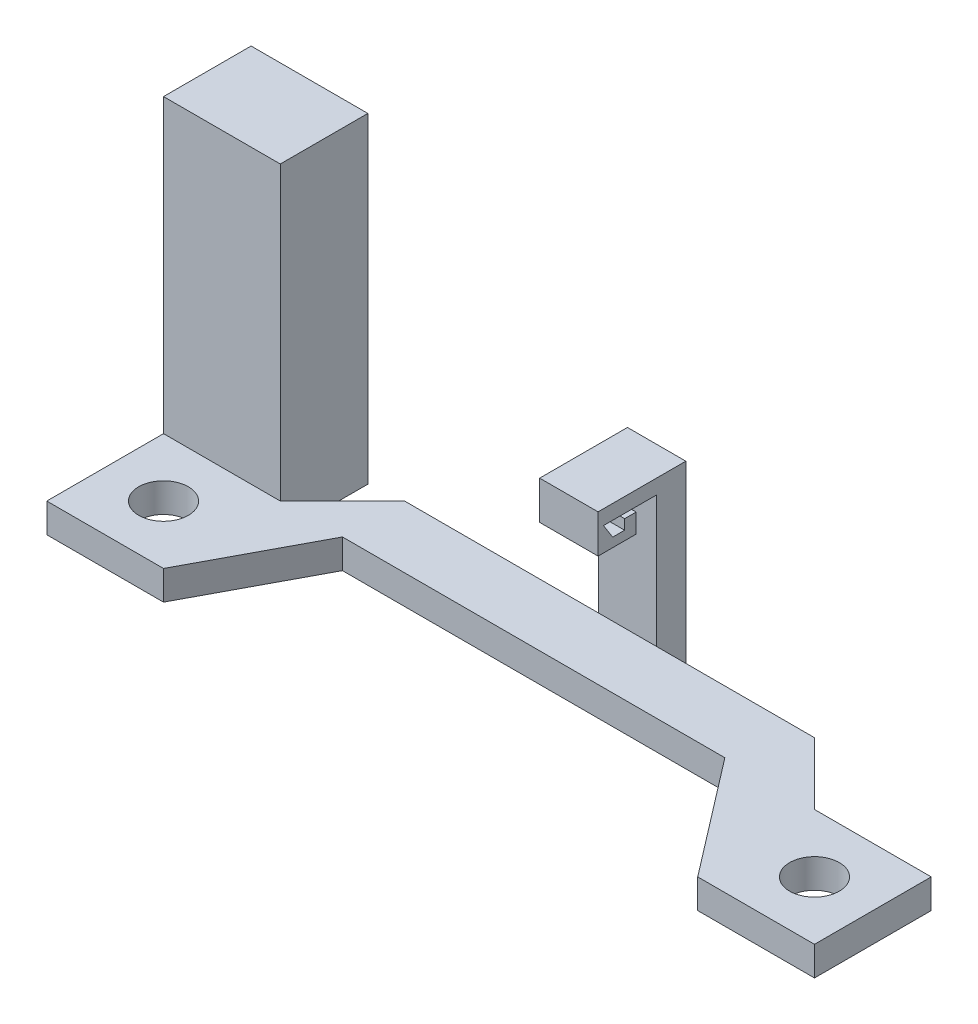
ISO-10303-21;
HEADER;
FILE_DESCRIPTION(('STEP AP214'),'2;1');
FILE_NAME('part.step','',(''),(''),'','','');
FILE_SCHEMA(('AUTOMOTIVE_DESIGN { 1 0 10303 214 1 1 1 1 }'));
ENDSEC;
DATA;
#1=APPLICATION_CONTEXT('core data for automotive mechanical design processes');
#2=APPLICATION_PROTOCOL_DEFINITION('international standard','automotive_design',2000,#1);
#3=PRODUCT_CONTEXT('',#1,'mechanical');
#4=PRODUCT('Part','Part','',(#3));
#5=PRODUCT_RELATED_PRODUCT_CATEGORY('part','',(#4));
#6=PRODUCT_DEFINITION_FORMATION('','',#4);
#7=PRODUCT_DEFINITION_CONTEXT('part definition',#1,'design');
#8=PRODUCT_DEFINITION('design','',#6,#7);
#9=PRODUCT_DEFINITION_SHAPE('','',#8);
#10=(LENGTH_UNIT() NAMED_UNIT(*) SI_UNIT(.MILLI.,.METRE.));
#11=(NAMED_UNIT(*) PLANE_ANGLE_UNIT() SI_UNIT($,.RADIAN.));
#12=(NAMED_UNIT(*) SI_UNIT($,.STERADIAN.) SOLID_ANGLE_UNIT());
#13=UNCERTAINTY_MEASURE_WITH_UNIT(LENGTH_MEASURE(1.E-05),#10,'distance_accuracy_value','');
#14=(GEOMETRIC_REPRESENTATION_CONTEXT(3) GLOBAL_UNCERTAINTY_ASSIGNED_CONTEXT((#13)) GLOBAL_UNIT_ASSIGNED_CONTEXT((#10,
#11,#12)) REPRESENTATION_CONTEXT('',''));
#15=CARTESIAN_POINT('',(0.,0.,0.));
#16=DIRECTION('',(0.,0.,1.));
#17=DIRECTION('',(1.,0.,0.));
#18=AXIS2_PLACEMENT_3D('',#15,#16,#17);
#19=CARTESIAN_POINT('',(46.1527781522757,2.54,-10.4892218477242));
#20=DIRECTION('',(0.,0.,1.));
#21=DIRECTION('',(1.,0.,0.));
#22=AXIS2_PLACEMENT_3D('',#19,#20,#21);
#23=PLANE('',#22);
#24=DIRECTION('',(-1.,0.,0.));
#25=VECTOR('',#24,1.);
#26=CARTESIAN_POINT('',(46.1527781522757,2.54,-10.4892218477242));
#27=LINE('',#26,#25);
#28=CARTESIAN_POINT('',(27.3386529054238,2.54,-10.4892218477242));
#29=VERTEX_POINT('',#28);
#30=CARTESIAN_POINT('',(10.4892218477242,2.54,-10.4892218477242));
#31=VERTEX_POINT('',#30);
#32=EDGE_CURVE('E57',#29,#31,#27,.T.);
#33=ORIENTED_EDGE('',*,*,#32,.F.);
#34=DIRECTION('',(0.,1.,0.));
#35=VECTOR('',#34,1.);
#36=CARTESIAN_POINT('',(27.3386529054238,0.,-10.4892218477242));
#37=LINE('',#36,#35);
#38=CARTESIAN_POINT('',(27.3386529054238,0.,-10.4892218477242));
#39=VERTEX_POINT('',#38);
#40=EDGE_CURVE('E354',#39,#29,#37,.T.);
#41=ORIENTED_EDGE('',*,*,#40,.F.);
#42=DIRECTION('',(-1.,0.,0.));
#43=VECTOR('',#42,1.);
#44=CARTESIAN_POINT('',(46.1527781522757,0.,-10.4892218477242));
#45=LINE('',#44,#43);
#46=CARTESIAN_POINT('',(10.4892218477242,0.,-10.4892218477242));
#47=VERTEX_POINT('',#46);
#48=EDGE_CURVE('E490',#39,#47,#45,.T.);
#49=ORIENTED_EDGE('',*,*,#48,.T.);
#50=DIRECTION('',(0.,-1.,0.));
#51=VECTOR('',#50,1.);
#52=CARTESIAN_POINT('',(10.4892218477242,2.54,-10.4892218477242));
#53=LINE('',#52,#51);
#54=EDGE_CURVE('E456',#31,#47,#53,.T.);
#55=ORIENTED_EDGE('',*,*,#54,.F.);
#56=EDGE_LOOP('',(#33,#41,#49,#55));
#57=FACE_BOUND('',#56,.T.);
#58=ADVANCED_FACE('F41',(#57),#23,.F.);
#59=CARTESIAN_POINT('',(0.,2.54,0.));
#60=DIRECTION('',(0.,1.,0.));
#61=DIRECTION('',(0.,0.,1.));
#62=AXIS2_PLACEMENT_3D('',#59,#60,#61);
#63=PLANE('',#62);
#64=CARTESIAN_POINT('',(0.,2.54,0.));
#65=DIRECTION('',(0.,1.,0.));
#66=DIRECTION('',(0.,0.,1.));
#67=AXIS2_PLACEMENT_3D('',#64,#65,#66);
#68=CIRCLE('',#67,2.159);
#69=CARTESIAN_POINT('',(0.,2.54,2.159));
#70=VERTEX_POINT('',#69);
#71=EDGE_CURVE('E409',#70,#70,#68,.T.);
#72=ORIENTED_EDGE('',*,*,#71,.F.);
#73=EDGE_LOOP('',(#72));
#74=FACE_BOUND('',#73,.T.);
#75=DIRECTION('',(-0.707106781186546,0.,0.707106781186549));
#76=VECTOR('',#75,1.);
#77=CARTESIAN_POINT('',(5.08000000000001,2.54,-5.08));
#78=LINE('',#77,#76);
#79=CARTESIAN_POINT('',(5.08000000000001,2.54,-5.08));
#80=VERTEX_POINT('',#79);
#81=EDGE_CURVE('E417',#31,#80,#78,.T.);
#82=ORIENTED_EDGE('',*,*,#81,.T.);
#83=DIRECTION('',(-1.,0.,0.));
#84=VECTOR('',#83,1.);
#85=CARTESIAN_POINT('',(5.08000000000001,2.54,-5.08));
#86=LINE('',#85,#84);
#87=CARTESIAN_POINT('',(-5.08,2.54,-5.08));
#88=VERTEX_POINT('',#87);
#89=EDGE_CURVE('E421',#80,#88,#86,.T.);
#90=ORIENTED_EDGE('',*,*,#89,.T.);
#91=DIRECTION('',(0.,0.,1.));
#92=VECTOR('',#91,1.);
#93=CARTESIAN_POINT('',(-5.08,2.54,-5.08));
#94=LINE('',#93,#92);
#95=CARTESIAN_POINT('',(-5.08,2.54,5.08));
#96=VERTEX_POINT('',#95);
#97=EDGE_CURVE('E426',#88,#96,#94,.T.);
#98=ORIENTED_EDGE('',*,*,#97,.T.);
#99=DIRECTION('',(1.,0.,0.));
#100=VECTOR('',#99,1.);
#101=CARTESIAN_POINT('',(-5.08,2.54,5.08));
#102=LINE('',#101,#100);
#103=CARTESIAN_POINT('',(5.08,2.54,5.08));
#104=VERTEX_POINT('',#103);
#105=EDGE_CURVE('E429',#96,#104,#102,.T.);
#106=ORIENTED_EDGE('',*,*,#105,.T.);
#107=DIRECTION('',(0.469949268426899,0.,-0.882693426453954));
#108=VECTOR('',#107,1.);
#109=CARTESIAN_POINT('',(5.08,2.54,5.08));
#110=LINE('',#109,#108);
#111=CARTESIAN_POINT('',(10.4892218477242,2.54,-5.08));
#112=VERTEX_POINT('',#111);
#113=EDGE_CURVE('E432',#104,#112,#110,.T.);
#114=ORIENTED_EDGE('',*,*,#113,.T.);
#115=DIRECTION('',(1.,0.,0.));
#116=VECTOR('',#115,1.);
#117=CARTESIAN_POINT('',(10.4892218477242,2.54,-5.08));
#118=LINE('',#117,#116);
#119=CARTESIAN_POINT('',(43.7641842977874,2.54,-5.08));
#120=VERTEX_POINT('',#119);
#121=EDGE_CURVE('E435',#112,#120,#118,.T.);
#122=ORIENTED_EDGE('',*,*,#121,.T.);
#123=DIRECTION('',(0.608848582260036,0.,0.793286457643104));
#124=VECTOR('',#123,1.);
#125=CARTESIAN_POINT('',(43.7641842977874,2.54,-5.08));
#126=LINE('',#125,#124);
#127=CARTESIAN_POINT('',(51.562,2.54,5.08));
#128=VERTEX_POINT('',#127);
#129=EDGE_CURVE('E438',#120,#128,#126,.T.);
#130=ORIENTED_EDGE('',*,*,#129,.T.);
#131=DIRECTION('',(1.,0.,0.));
#132=VECTOR('',#131,1.);
#133=CARTESIAN_POINT('',(61.722,2.54,5.08));
#134=LINE('',#133,#132);
#135=CARTESIAN_POINT('',(61.722,2.54,5.08));
#136=VERTEX_POINT('',#135);
#137=EDGE_CURVE('E441',#128,#136,#134,.T.);
#138=ORIENTED_EDGE('',*,*,#137,.T.);
#139=DIRECTION('',(0.,0.,-1.));
#140=VECTOR('',#139,1.);
#141=CARTESIAN_POINT('',(61.722,2.54,-5.08));
#142=LINE('',#141,#140);
#143=CARTESIAN_POINT('',(61.722,2.54,-5.08));
#144=VERTEX_POINT('',#143);
#145=EDGE_CURVE('E444',#136,#144,#142,.T.);
#146=ORIENTED_EDGE('',*,*,#145,.T.);
#147=DIRECTION('',(-1.,0.,0.));
#148=VECTOR('',#147,1.);
#149=CARTESIAN_POINT('',(56.642,2.54,-5.08));
#150=LINE('',#149,#148);
#151=CARTESIAN_POINT('',(51.562,2.54,-5.08));
#152=VERTEX_POINT('',#151);
#153=EDGE_CURVE('E447',#144,#152,#150,.T.);
#154=ORIENTED_EDGE('',*,*,#153,.T.);
#155=DIRECTION('',(-0.707106781186551,0.,-0.707106781186544));
#156=VECTOR('',#155,1.);
#157=CARTESIAN_POINT('',(51.562,2.54,-5.08));
#158=LINE('',#157,#156);
#159=CARTESIAN_POINT('',(46.1527781522757,2.54,-10.4892218477242));
#160=VERTEX_POINT('',#159);
#161=EDGE_CURVE('E450',#152,#160,#158,.T.);
#162=ORIENTED_EDGE('',*,*,#161,.T.);
#163=CARTESIAN_POINT('',(32.4186529054238,2.54,-10.4892218477242));
#164=VERTEX_POINT('',#163);
#165=EDGE_CURVE('E453',#160,#164,#27,.T.);
#166=ORIENTED_EDGE('',*,*,#165,.T.);
#167=EDGE_CURVE('E457',#164,#29,#27,.T.);
#168=ORIENTED_EDGE('',*,*,#167,.T.);
#169=ORIENTED_EDGE('',*,*,#32,.T.);
#170=EDGE_LOOP('',(#82,#90,#98,#106,#114,#122,#130,#138,#146,#154,#162,#166,#168,#169));
#171=FACE_BOUND('',#170,.T.);
#172=CARTESIAN_POINT('',(56.642,2.54,0.));
#173=DIRECTION('',(0.,1.,0.));
#174=DIRECTION('',(0.,0.,1.));
#175=AXIS2_PLACEMENT_3D('',#172,#173,#174);
#176=CIRCLE('',#175,2.15899999999999);
#177=CARTESIAN_POINT('',(56.642,2.54,2.15899999999999));
#178=VERTEX_POINT('',#177);
#179=EDGE_CURVE('E401',#178,#178,#176,.T.);
#180=ORIENTED_EDGE('',*,*,#179,.F.);
#181=EDGE_LOOP('',(#180));
#182=FACE_BOUND('',#181,.T.);
#183=ADVANCED_FACE('F558',(#74,#171,#182),#63,.T.);
#184=CARTESIAN_POINT('',(0.,0.,0.));
#185=DIRECTION('',(0.,1.,0.));
#186=DIRECTION('',(0.,0.,1.));
#187=AXIS2_PLACEMENT_3D('',#184,#185,#186);
#188=PLANE('',#187);
#189=DIRECTION('',(-0.707106781186546,0.,0.707106781186549));
#190=VECTOR('',#189,1.);
#191=CARTESIAN_POINT('',(5.08000000000001,0.,-5.08));
#192=LINE('',#191,#190);
#193=CARTESIAN_POINT('',(5.08000000000001,0.,-5.08));
#194=VERTEX_POINT('',#193);
#195=EDGE_CURVE('E413',#47,#194,#192,.T.);
#196=ORIENTED_EDGE('',*,*,#195,.F.);
#197=ORIENTED_EDGE('',*,*,#48,.F.);
#198=DIRECTION('',(0.,0.,1.));
#199=VECTOR('',#198,1.);
#200=CARTESIAN_POINT('',(27.3386529054238,0.,-13.0292218477242));
#201=LINE('',#200,#199);
#202=CARTESIAN_POINT('',(27.3386529054238,0.,-13.0292218477242));
#203=VERTEX_POINT('',#202);
#204=EDGE_CURVE('E349',#203,#39,#201,.T.);
#205=ORIENTED_EDGE('',*,*,#204,.F.);
#206=DIRECTION('',(-1.,0.,0.));
#207=VECTOR('',#206,1.);
#208=CARTESIAN_POINT('',(32.4186529054238,0.,-13.0292218477242));
#209=LINE('',#208,#207);
#210=CARTESIAN_POINT('',(32.4186529054238,0.,-13.0292218477242));
#211=VERTEX_POINT('',#210);
#212=EDGE_CURVE('E345',#211,#203,#209,.T.);
#213=ORIENTED_EDGE('',*,*,#212,.F.);
#214=DIRECTION('',(0.,0.,-1.));
#215=VECTOR('',#214,1.);
#216=CARTESIAN_POINT('',(32.4186529054238,0.,-10.4892218477242));
#217=LINE('',#216,#215);
#218=CARTESIAN_POINT('',(32.4186529054238,0.,-10.4892218477242));
#219=VERTEX_POINT('',#218);
#220=EDGE_CURVE('E237',#219,#211,#217,.T.);
#221=ORIENTED_EDGE('',*,*,#220,.F.);
#222=CARTESIAN_POINT('',(46.1527781522757,0.,-10.4892218477242));
#223=VERTEX_POINT('',#222);
#224=EDGE_CURVE('E422',#223,#219,#45,.T.);
#225=ORIENTED_EDGE('',*,*,#224,.F.);
#226=DIRECTION('',(-0.707106781186551,0.,-0.707106781186544));
#227=VECTOR('',#226,1.);
#228=CARTESIAN_POINT('',(51.562,0.,-5.08));
#229=LINE('',#228,#227);
#230=CARTESIAN_POINT('',(51.562,0.,-5.08));
#231=VERTEX_POINT('',#230);
#232=EDGE_CURVE('E487',#231,#223,#229,.T.);
#233=ORIENTED_EDGE('',*,*,#232,.F.);
#234=DIRECTION('',(-1.,0.,0.));
#235=VECTOR('',#234,1.);
#236=CARTESIAN_POINT('',(51.562,0.,-5.08));
#237=LINE('',#236,#235);
#238=CARTESIAN_POINT('',(61.722,0.,-5.08));
#239=VERTEX_POINT('',#238);
#240=EDGE_CURVE('E484',#239,#231,#237,.T.);
#241=ORIENTED_EDGE('',*,*,#240,.F.);
#242=DIRECTION('',(0.,0.,-1.));
#243=VECTOR('',#242,1.);
#244=CARTESIAN_POINT('',(61.722,0.,-5.08));
#245=LINE('',#244,#243);
#246=CARTESIAN_POINT('',(61.722,0.,5.08));
#247=VERTEX_POINT('',#246);
#248=EDGE_CURVE('E480',#247,#239,#245,.T.);
#249=ORIENTED_EDGE('',*,*,#248,.F.);
#250=DIRECTION('',(1.,0.,0.));
#251=VECTOR('',#250,1.);
#252=CARTESIAN_POINT('',(61.722,0.,5.08));
#253=LINE('',#252,#251);
#254=CARTESIAN_POINT('',(51.562,0.,5.08));
#255=VERTEX_POINT('',#254);
#256=EDGE_CURVE('E477',#255,#247,#253,.T.);
#257=ORIENTED_EDGE('',*,*,#256,.F.);
#258=DIRECTION('',(0.608848582260036,0.,0.793286457643104));
#259=VECTOR('',#258,1.);
#260=CARTESIAN_POINT('',(43.7641842977874,0.,-5.08));
#261=LINE('',#260,#259);
#262=CARTESIAN_POINT('',(43.7641842977874,0.,-5.08));
#263=VERTEX_POINT('',#262);
#264=EDGE_CURVE('E474',#263,#255,#261,.T.);
#265=ORIENTED_EDGE('',*,*,#264,.F.);
#266=DIRECTION('',(1.,0.,0.));
#267=VECTOR('',#266,1.);
#268=CARTESIAN_POINT('',(10.4892218477242,0.,-5.08));
#269=LINE('',#268,#267);
#270=CARTESIAN_POINT('',(10.4892218477242,0.,-5.08));
#271=VERTEX_POINT('',#270);
#272=EDGE_CURVE('E471',#271,#263,#269,.T.);
#273=ORIENTED_EDGE('',*,*,#272,.F.);
#274=DIRECTION('',(0.469949268426899,0.,-0.882693426453954));
#275=VECTOR('',#274,1.);
#276=CARTESIAN_POINT('',(5.08,0.,5.08));
#277=LINE('',#276,#275);
#278=CARTESIAN_POINT('',(5.08,0.,5.08));
#279=VERTEX_POINT('',#278);
#280=EDGE_CURVE('E468',#279,#271,#277,.T.);
#281=ORIENTED_EDGE('',*,*,#280,.F.);
#282=DIRECTION('',(1.,0.,0.));
#283=VECTOR('',#282,1.);
#284=CARTESIAN_POINT('',(0.,0.,5.08));
#285=LINE('',#284,#283);
#286=CARTESIAN_POINT('',(-5.08,0.,5.08));
#287=VERTEX_POINT('',#286);
#288=EDGE_CURVE('E465',#287,#279,#285,.T.);
#289=ORIENTED_EDGE('',*,*,#288,.F.);
#290=DIRECTION('',(0.,0.,1.));
#291=VECTOR('',#290,1.);
#292=CARTESIAN_POINT('',(-5.08,0.,-5.08));
#293=LINE('',#292,#291);
#294=CARTESIAN_POINT('',(-5.08,0.,-12.7));
#295=VERTEX_POINT('',#294);
#296=EDGE_CURVE('E461',#295,#287,#293,.T.);
#297=ORIENTED_EDGE('',*,*,#296,.F.);
#298=DIRECTION('',(1.,0.,0.));
#299=VECTOR('',#298,1.);
#300=CARTESIAN_POINT('',(0.,0.,-12.7));
#301=LINE('',#300,#299);
#302=CARTESIAN_POINT('',(5.08,0.,-12.7));
#303=VERTEX_POINT('',#302);
#304=EDGE_CURVE('E385',#295,#303,#301,.T.);
#305=ORIENTED_EDGE('',*,*,#304,.T.);
#306=DIRECTION('',(0.,0.,1.));
#307=VECTOR('',#306,1.);
#308=CARTESIAN_POINT('',(5.08,0.,0.));
#309=LINE('',#308,#307);
#310=EDGE_CURVE('E382',#303,#194,#309,.T.);
#311=ORIENTED_EDGE('',*,*,#310,.T.);
#312=EDGE_LOOP('',(#196,#197,#205,#213,#221,#225,#233,#241,#249,#257,#265,#273,#281,#289,#297,
#305,#311));
#313=FACE_BOUND('',#312,.T.);
#314=CARTESIAN_POINT('',(0.,0.,0.));
#315=DIRECTION('',(0.,1.,0.));
#316=DIRECTION('',(0.,0.,1.));
#317=AXIS2_PLACEMENT_3D('',#314,#315,#316);
#318=CIRCLE('',#317,2.159);
#319=CARTESIAN_POINT('',(0.,0.,2.159));
#320=VERTEX_POINT('',#319);
#321=EDGE_CURVE('E405',#320,#320,#318,.T.);
#322=ORIENTED_EDGE('',*,*,#321,.T.);
#323=EDGE_LOOP('',(#322));
#324=FACE_BOUND('',#323,.T.);
#325=CARTESIAN_POINT('',(56.642,0.,0.));
#326=DIRECTION('',(0.,1.,0.));
#327=DIRECTION('',(0.,0.,1.));
#328=AXIS2_PLACEMENT_3D('',#325,#326,#327);
#329=CIRCLE('',#328,2.15899999999999);
#330=CARTESIAN_POINT('',(56.642,0.,2.15899999999999));
#331=VERTEX_POINT('',#330);
#332=EDGE_CURVE('E392',#331,#331,#329,.T.);
#333=ORIENTED_EDGE('',*,*,#332,.T.);
#334=EDGE_LOOP('',(#333));
#335=FACE_BOUND('',#334,.T.);
#336=ADVANCED_FACE('F542',(#313,#324,#335),#188,.F.);
#337=CARTESIAN_POINT('',(5.08000000000001,2.54,-5.08));
#338=DIRECTION('',(0.707106781186549,0.,0.707106781186546));
#339=DIRECTION('',(0.707106781186546,0.,-0.707106781186549));
#340=AXIS2_PLACEMENT_3D('',#337,#338,#339);
#341=PLANE('',#340);
#342=ORIENTED_EDGE('',*,*,#195,.T.);
#343=DIRECTION('',(0.,-1.,0.));
#344=VECTOR('',#343,1.);
#345=CARTESIAN_POINT('',(5.08000000000001,2.54,-5.08));
#346=LINE('',#345,#344);
#347=EDGE_CURVE('E11',#80,#194,#346,.T.);
#348=ORIENTED_EDGE('',*,*,#347,.F.);
#349=ORIENTED_EDGE('',*,*,#81,.F.);
#350=ORIENTED_EDGE('',*,*,#54,.T.);
#351=EDGE_LOOP('',(#342,#348,#349,#350));
#352=FACE_BOUND('',#351,.T.);
#353=ADVANCED_FACE('F43',(#352),#341,.F.);
#354=CARTESIAN_POINT('',(-5.08,2.54,-5.08));
#355=DIRECTION('',(1.,0.,0.));
#356=DIRECTION('',(0.,0.,-1.));
#357=AXIS2_PLACEMENT_3D('',#354,#355,#356);
#358=PLANE('',#357);
#359=ORIENTED_EDGE('',*,*,#296,.T.);
#360=DIRECTION('',(0.,-1.,0.));
#361=VECTOR('',#360,1.);
#362=CARTESIAN_POINT('',(-5.08,2.54,5.08));
#363=LINE('',#362,#361);
#364=EDGE_CURVE('E50',#96,#287,#363,.T.);
#365=ORIENTED_EDGE('',*,*,#364,.F.);
#366=ORIENTED_EDGE('',*,*,#97,.F.);
#367=DIRECTION('',(0.,1.,0.));
#368=VECTOR('',#367,1.);
#369=CARTESIAN_POINT('',(-5.08,0.,-5.08));
#370=LINE('',#369,#368);
#371=CARTESIAN_POINT('',(-5.08,27.94,-5.08));
#372=VERTEX_POINT('',#371);
#373=EDGE_CURVE('E393',#88,#372,#370,.T.);
#374=ORIENTED_EDGE('',*,*,#373,.T.);
#375=DIRECTION('',(0.,0.,1.));
#376=VECTOR('',#375,1.);
#377=CARTESIAN_POINT('',(-5.08,27.94,0.));
#378=LINE('',#377,#376);
#379=CARTESIAN_POINT('',(-5.08,27.94,-12.7));
#380=VERTEX_POINT('',#379);
#381=EDGE_CURVE('E374',#380,#372,#378,.T.);
#382=ORIENTED_EDGE('',*,*,#381,.F.);
#383=DIRECTION('',(0.,1.,0.));
#384=VECTOR('',#383,1.);
#385=CARTESIAN_POINT('',(-5.08,0.,-12.7));
#386=LINE('',#385,#384);
#387=EDGE_CURVE('E396',#295,#380,#386,.T.);
#388=ORIENTED_EDGE('',*,*,#387,.F.);
#389=EDGE_LOOP('',(#359,#365,#366,#374,#382,#388));
#390=FACE_BOUND('',#389,.T.);
#391=ADVANCED_FACE('F536',(#390),#358,.F.);
#392=CARTESIAN_POINT('',(0.,2.54,5.08));
#393=DIRECTION('',(0.,0.,-1.));
#394=DIRECTION('',(-1.,0.,0.));
#395=AXIS2_PLACEMENT_3D('',#392,#393,#394);
#396=PLANE('',#395);
#397=ORIENTED_EDGE('',*,*,#288,.T.);
#398=DIRECTION('',(0.,-1.,0.));
#399=VECTOR('',#398,1.);
#400=CARTESIAN_POINT('',(5.08,2.54,5.08));
#401=LINE('',#400,#399);
#402=EDGE_CURVE('E524',#104,#279,#401,.T.);
#403=ORIENTED_EDGE('',*,*,#402,.F.);
#404=ORIENTED_EDGE('',*,*,#105,.F.);
#405=ORIENTED_EDGE('',*,*,#364,.T.);
#406=EDGE_LOOP('',(#397,#403,#404,#405));
#407=FACE_BOUND('',#406,.T.);
#408=ADVANCED_FACE('F532',(#407),#396,.F.);
#409=CARTESIAN_POINT('',(5.08,2.54,5.08));
#410=DIRECTION('',(-0.882693426453954,0.,-0.469949268426899));
#411=DIRECTION('',(-0.469949268426899,0.,0.882693426453954));
#412=AXIS2_PLACEMENT_3D('',#409,#410,#411);
#413=PLANE('',#412);
#414=ORIENTED_EDGE('',*,*,#280,.T.);
#415=DIRECTION('',(0.,-1.,0.));
#416=VECTOR('',#415,1.);
#417=CARTESIAN_POINT('',(10.4892218477242,2.54,-5.08));
#418=LINE('',#417,#416);
#419=EDGE_CURVE('E520',#112,#271,#418,.T.);
#420=ORIENTED_EDGE('',*,*,#419,.F.);
#421=ORIENTED_EDGE('',*,*,#113,.F.);
#422=ORIENTED_EDGE('',*,*,#402,.T.);
#423=EDGE_LOOP('',(#414,#420,#421,#422));
#424=FACE_BOUND('',#423,.T.);
#425=ADVANCED_FACE('F550',(#424),#413,.F.);
#426=CARTESIAN_POINT('',(10.4892218477242,2.54,-5.08));
#427=DIRECTION('',(0.,0.,-1.));
#428=DIRECTION('',(-1.,0.,0.));
#429=AXIS2_PLACEMENT_3D('',#426,#427,#428);
#430=PLANE('',#429);
#431=ORIENTED_EDGE('',*,*,#272,.T.);
#432=DIRECTION('',(0.,-1.,0.));
#433=VECTOR('',#432,1.);
#434=CARTESIAN_POINT('',(43.7641842977874,2.54,-5.08));
#435=LINE('',#434,#433);
#436=EDGE_CURVE('E516',#120,#263,#435,.T.);
#437=ORIENTED_EDGE('',*,*,#436,.F.);
#438=ORIENTED_EDGE('',*,*,#121,.F.);
#439=ORIENTED_EDGE('',*,*,#419,.T.);
#440=EDGE_LOOP('',(#431,#437,#438,#439));
#441=FACE_BOUND('',#440,.T.);
#442=ADVANCED_FACE('F554',(#441),#430,.F.);
#443=CARTESIAN_POINT('',(43.7641842977874,2.54,-5.08));
#444=DIRECTION('',(0.793286457643104,0.,-0.608848582260036));
#445=DIRECTION('',(-0.608848582260036,0.,-0.793286457643104));
#446=AXIS2_PLACEMENT_3D('',#443,#444,#445);
#447=PLANE('',#446);
#448=ORIENTED_EDGE('',*,*,#264,.T.);
#449=DIRECTION('',(0.,-1.,0.));
#450=VECTOR('',#449,1.);
#451=CARTESIAN_POINT('',(51.562,2.54,5.08));
#452=LINE('',#451,#450);
#453=EDGE_CURVE('E512',#128,#255,#452,.T.);
#454=ORIENTED_EDGE('',*,*,#453,.F.);
#455=ORIENTED_EDGE('',*,*,#129,.F.);
#456=ORIENTED_EDGE('',*,*,#436,.T.);
#457=EDGE_LOOP('',(#448,#454,#455,#456));
#458=FACE_BOUND('',#457,.T.);
#459=ADVANCED_FACE('F653',(#458),#447,.F.);
#460=CARTESIAN_POINT('',(61.722,2.54,5.08));
#461=DIRECTION('',(0.,0.,-1.));
#462=DIRECTION('',(-1.,0.,0.));
#463=AXIS2_PLACEMENT_3D('',#460,#461,#462);
#464=PLANE('',#463);
#465=ORIENTED_EDGE('',*,*,#256,.T.);
#466=DIRECTION('',(0.,-1.,0.));
#467=VECTOR('',#466,1.);
#468=CARTESIAN_POINT('',(61.722,2.54,5.08));
#469=LINE('',#468,#467);
#470=EDGE_CURVE('E508',#136,#247,#469,.T.);
#471=ORIENTED_EDGE('',*,*,#470,.F.);
#472=ORIENTED_EDGE('',*,*,#137,.F.);
#473=ORIENTED_EDGE('',*,*,#453,.T.);
#474=EDGE_LOOP('',(#465,#471,#472,#473));
#475=FACE_BOUND('',#474,.T.);
#476=ADVANCED_FACE('F650',(#475),#464,.F.);
#477=CARTESIAN_POINT('',(61.722,2.54,-5.08));
#478=DIRECTION('',(-1.,0.,0.));
#479=DIRECTION('',(0.,0.,1.));
#480=AXIS2_PLACEMENT_3D('',#477,#478,#479);
#481=PLANE('',#480);
#482=ORIENTED_EDGE('',*,*,#248,.T.);
#483=DIRECTION('',(0.,-1.,0.));
#484=VECTOR('',#483,1.);
#485=CARTESIAN_POINT('',(61.722,2.54,-5.08));
#486=LINE('',#485,#484);
#487=EDGE_CURVE('E504',#144,#239,#486,.T.);
#488=ORIENTED_EDGE('',*,*,#487,.F.);
#489=ORIENTED_EDGE('',*,*,#145,.F.);
#490=ORIENTED_EDGE('',*,*,#470,.T.);
#491=EDGE_LOOP('',(#482,#488,#489,#490));
#492=FACE_BOUND('',#491,.T.);
#493=ADVANCED_FACE('F646',(#492),#481,.F.);
#494=CARTESIAN_POINT('',(51.562,2.54,-5.08));
#495=DIRECTION('',(0.,0.,1.));
#496=DIRECTION('',(1.,0.,0.));
#497=AXIS2_PLACEMENT_3D('',#494,#495,#496);
#498=PLANE('',#497);
#499=ORIENTED_EDGE('',*,*,#240,.T.);
#500=DIRECTION('',(0.,-1.,0.));
#501=VECTOR('',#500,1.);
#502=CARTESIAN_POINT('',(51.562,2.54,-5.08));
#503=LINE('',#502,#501);
#504=EDGE_CURVE('E500',#152,#231,#503,.T.);
#505=ORIENTED_EDGE('',*,*,#504,.F.);
#506=ORIENTED_EDGE('',*,*,#153,.F.);
#507=ORIENTED_EDGE('',*,*,#487,.T.);
#508=EDGE_LOOP('',(#499,#505,#506,#507));
#509=FACE_BOUND('',#508,.T.);
#510=ADVANCED_FACE('F634',(#509),#498,.F.);
#511=CARTESIAN_POINT('',(51.562,2.54,-5.08));
#512=DIRECTION('',(-0.707106781186544,0.,0.707106781186551));
#513=DIRECTION('',(0.707106781186551,0.,0.707106781186544));
#514=AXIS2_PLACEMENT_3D('',#511,#512,#513);
#515=PLANE('',#514);
#516=ORIENTED_EDGE('',*,*,#232,.T.);
#517=DIRECTION('',(0.,-1.,0.));
#518=VECTOR('',#517,1.);
#519=CARTESIAN_POINT('',(46.1527781522757,2.54,-10.4892218477242));
#520=LINE('',#519,#518);
#521=EDGE_CURVE('E496',#160,#223,#520,.T.);
#522=ORIENTED_EDGE('',*,*,#521,.F.);
#523=ORIENTED_EDGE('',*,*,#161,.F.);
#524=ORIENTED_EDGE('',*,*,#504,.T.);
#525=EDGE_LOOP('',(#516,#522,#523,#524));
#526=FACE_BOUND('',#525,.T.);
#527=ADVANCED_FACE('F626',(#526),#515,.F.);
#528=ORIENTED_EDGE('',*,*,#224,.T.);
#529=DIRECTION('',(0.,1.,0.));
#530=VECTOR('',#529,1.);
#531=CARTESIAN_POINT('',(32.4186529054238,0.,-10.4892218477242));
#532=LINE('',#531,#530);
#533=EDGE_CURVE('E65',#219,#164,#532,.T.);
#534=ORIENTED_EDGE('',*,*,#533,.T.);
#535=ORIENTED_EDGE('',*,*,#165,.F.);
#536=ORIENTED_EDGE('',*,*,#521,.T.);
#537=EDGE_LOOP('',(#528,#534,#535,#536));
#538=FACE_BOUND('',#537,.T.);
#539=ADVANCED_FACE('F616',(#538),#23,.F.);
#540=CARTESIAN_POINT('',(0.,2.54,0.));
#541=DIRECTION('',(0.,-1.,0.));
#542=DIRECTION('',(0.,0.,-1.));
#543=AXIS2_PLACEMENT_3D('',#540,#541,#542);
#544=CYLINDRICAL_SURFACE('',#543,2.159);
#545=ORIENTED_EDGE('',*,*,#71,.T.);
#546=EDGE_LOOP('',(#545));
#547=FACE_BOUND('',#546,.T.);
#548=ORIENTED_EDGE('',*,*,#321,.F.);
#549=EDGE_LOOP('',(#548));
#550=FACE_BOUND('',#549,.T.);
#551=ADVANCED_FACE('F625',(#547,#550),#544,.F.);
#552=CARTESIAN_POINT('',(56.642,2.54,0.));
#553=DIRECTION('',(0.,-1.,0.));
#554=DIRECTION('',(0.,0.,-1.));
#555=AXIS2_PLACEMENT_3D('',#552,#553,#554);
#556=CYLINDRICAL_SURFACE('',#555,2.15899999999999);
#557=ORIENTED_EDGE('',*,*,#179,.T.);
#558=EDGE_LOOP('',(#557));
#559=FACE_BOUND('',#558,.T.);
#560=ORIENTED_EDGE('',*,*,#332,.F.);
#561=EDGE_LOOP('',(#560));
#562=FACE_BOUND('',#561,.T.);
#563=ADVANCED_FACE('F631',(#559,#562),#556,.F.);
#564=CARTESIAN_POINT('',(5.08,0.,0.));
#565=DIRECTION('',(-1.,0.,0.));
#566=DIRECTION('',(0.,0.,1.));
#567=AXIS2_PLACEMENT_3D('',#564,#565,#566);
#568=PLANE('',#567);
#569=DIRECTION('',(0.,1.,0.));
#570=VECTOR('',#569,1.);
#571=CARTESIAN_POINT('',(5.08,0.,-12.7));
#572=LINE('',#571,#570);
#573=CARTESIAN_POINT('',(5.08,27.94,-12.7));
#574=VERTEX_POINT('',#573);
#575=EDGE_CURVE('E388',#303,#574,#572,.T.);
#576=ORIENTED_EDGE('',*,*,#575,.T.);
#577=DIRECTION('',(0.,0.,1.));
#578=VECTOR('',#577,1.);
#579=CARTESIAN_POINT('',(5.08,27.94,0.));
#580=LINE('',#579,#578);
#581=CARTESIAN_POINT('',(5.08000000000001,27.94,-5.08));
#582=VERTEX_POINT('',#581);
#583=EDGE_CURVE('E357',#574,#582,#580,.T.);
#584=ORIENTED_EDGE('',*,*,#583,.T.);
#585=DIRECTION('',(0.,1.,0.));
#586=VECTOR('',#585,1.);
#587=CARTESIAN_POINT('',(5.08000000000001,0.,-5.08));
#588=LINE('',#587,#586);
#589=EDGE_CURVE('E389',#80,#582,#588,.T.);
#590=ORIENTED_EDGE('',*,*,#589,.F.);
#591=ORIENTED_EDGE('',*,*,#347,.T.);
#592=ORIENTED_EDGE('',*,*,#310,.F.);
#593=EDGE_LOOP('',(#576,#584,#590,#591,#592));
#594=FACE_BOUND('',#593,.T.);
#595=ADVANCED_FACE('F567',(#594),#568,.F.);
#596=CARTESIAN_POINT('',(0.,0.,-5.08));
#597=DIRECTION('',(0.,0.,-1.));
#598=DIRECTION('',(-1.,0.,0.));
#599=AXIS2_PLACEMENT_3D('',#596,#597,#598);
#600=PLANE('',#599);
#601=ORIENTED_EDGE('',*,*,#89,.F.);
#602=ORIENTED_EDGE('',*,*,#589,.T.);
#603=DIRECTION('',(-1.,0.,0.));
#604=VECTOR('',#603,1.);
#605=CARTESIAN_POINT('',(0.,27.94,-5.08));
#606=LINE('',#605,#604);
#607=EDGE_CURVE('E378',#582,#372,#606,.T.);
#608=ORIENTED_EDGE('',*,*,#607,.T.);
#609=ORIENTED_EDGE('',*,*,#373,.F.);
#610=EDGE_LOOP('',(#601,#602,#608,#609));
#611=FACE_BOUND('',#610,.T.);
#612=ADVANCED_FACE('F565',(#611),#600,.F.);
#613=CARTESIAN_POINT('',(0.,0.,-12.7));
#614=DIRECTION('',(0.,0.,1.));
#615=DIRECTION('',(1.,0.,0.));
#616=AXIS2_PLACEMENT_3D('',#613,#614,#615);
#617=PLANE('',#616);
#618=ORIENTED_EDGE('',*,*,#387,.T.);
#619=DIRECTION('',(1.,0.,0.));
#620=VECTOR('',#619,1.);
#621=CARTESIAN_POINT('',(0.,27.94,-12.7));
#622=LINE('',#621,#620);
#623=EDGE_CURVE('E370',#380,#574,#622,.T.);
#624=ORIENTED_EDGE('',*,*,#623,.T.);
#625=ORIENTED_EDGE('',*,*,#575,.F.);
#626=ORIENTED_EDGE('',*,*,#304,.F.);
#627=EDGE_LOOP('',(#618,#624,#625,#626));
#628=FACE_BOUND('',#627,.T.);
#629=ADVANCED_FACE('F575',(#628),#617,.F.);
#630=CARTESIAN_POINT('',(0.,27.94,0.));
#631=DIRECTION('',(0.,1.,0.));
#632=DIRECTION('',(0.,0.,1.));
#633=AXIS2_PLACEMENT_3D('',#630,#631,#632);
#634=PLANE('',#633);
#635=ORIENTED_EDGE('',*,*,#583,.F.);
#636=ORIENTED_EDGE('',*,*,#623,.F.);
#637=ORIENTED_EDGE('',*,*,#381,.T.);
#638=ORIENTED_EDGE('',*,*,#607,.F.);
#639=EDGE_LOOP('',(#635,#636,#637,#638));
#640=FACE_BOUND('',#639,.T.);
#641=ADVANCED_FACE('F573',(#640),#634,.T.);
#642=CARTESIAN_POINT('',(27.3386529054238,0.,-10.4892218477242));
#643=DIRECTION('',(0.,0.,1.));
#644=DIRECTION('',(1.,0.,0.));
#645=AXIS2_PLACEMENT_3D('',#642,#643,#644);
#646=PLANE('',#645);
#647=DIRECTION('',(1.,0.,0.));
#648=VECTOR('',#647,1.);
#649=CARTESIAN_POINT('',(27.3386529054238,13.97,-10.4892218477242));
#650=LINE('',#649,#648);
#651=CARTESIAN_POINT('',(27.3386529054238,13.97,-10.4892218477242));
#652=VERTEX_POINT('',#651);
#653=CARTESIAN_POINT('',(32.4186529054238,13.97,-10.4892218477242));
#654=VERTEX_POINT('',#653);
#655=EDGE_CURVE('E312',#652,#654,#650,.T.);
#656=ORIENTED_EDGE('',*,*,#655,.F.);
#657=EDGE_CURVE('E358',#29,#652,#37,.T.);
#658=ORIENTED_EDGE('',*,*,#657,.F.);
#659=ORIENTED_EDGE('',*,*,#167,.F.);
#660=EDGE_CURVE('E353',#164,#654,#532,.T.);
#661=ORIENTED_EDGE('',*,*,#660,.T.);
#662=EDGE_LOOP('',(#656,#658,#659,#661));
#663=FACE_BOUND('',#662,.T.);
#664=ADVANCED_FACE('F587',(#663),#646,.T.);
#665=CARTESIAN_POINT('',(27.3386529054238,0.,-13.0292218477242));
#666=DIRECTION('',(-1.,0.,0.));
#667=DIRECTION('',(0.,0.,1.));
#668=AXIS2_PLACEMENT_3D('',#665,#666,#667);
#669=PLANE('',#668);
#670=ORIENTED_EDGE('',*,*,#40,.T.);
#671=ORIENTED_EDGE('',*,*,#657,.T.);
#672=DIRECTION('',(0.,0.,-1.));
#673=VECTOR('',#672,1.);
#674=CARTESIAN_POINT('',(27.3386529054238,13.97,-5.86509945621302));
#675=LINE('',#674,#673);
#676=CARTESIAN_POINT('',(27.3386529054238,13.97,-5.86509945621302));
#677=VERTEX_POINT('',#676);
#678=EDGE_CURVE('E249',#677,#652,#675,.T.);
#679=ORIENTED_EDGE('',*,*,#678,.F.);
#680=DIRECTION('',(0.,0.847175941779949,0.531312453900017));
#681=VECTOR('',#680,1.);
#682=CARTESIAN_POINT('',(27.3386529054238,12.7,-6.66158904376588));
#683=LINE('',#682,#681);
#684=CARTESIAN_POINT('',(27.3386529054238,12.7,-6.66158904376588));
#685=VERTEX_POINT('',#684);
#686=EDGE_CURVE('E281',#685,#677,#683,.T.);
#687=ORIENTED_EDGE('',*,*,#686,.F.);
#688=DIRECTION('',(0.,0.,1.));
#689=VECTOR('',#688,1.);
#690=CARTESIAN_POINT('',(27.3386529054238,12.7,-7.27189604881352));
#691=LINE('',#690,#689);
#692=CARTESIAN_POINT('',(27.3386529054238,12.7,-7.70380728338385));
#693=VERTEX_POINT('',#692);
#694=EDGE_CURVE('E278',#693,#685,#691,.T.);
#695=ORIENTED_EDGE('',*,*,#694,.F.);
#696=DIRECTION('',(0.,-1.,0.));
#697=VECTOR('',#696,1.);
#698=CARTESIAN_POINT('',(27.3386529054238,12.7,-7.70380728338385));
#699=LINE('',#698,#697);
#700=CARTESIAN_POINT('',(27.3386529054238,13.5702721354625,-7.70380728338385));
#701=VERTEX_POINT('',#700);
#702=EDGE_CURVE('E274',#701,#693,#699,.T.);
#703=ORIENTED_EDGE('',*,*,#702,.F.);
#704=DIRECTION('',(0.,0.,1.));
#705=VECTOR('',#704,1.);
#706=CARTESIAN_POINT('',(27.3386529054238,13.5702721354625,-7.70380728338385));
#707=LINE('',#706,#705);
#708=CARTESIAN_POINT('',(27.3386529054238,13.5702721354625,-8.70337328338947));
#709=VERTEX_POINT('',#708);
#710=EDGE_CURVE('E270',#709,#701,#707,.T.);
#711=ORIENTED_EDGE('',*,*,#710,.F.);
#712=DIRECTION('',(0.,1.,0.));
#713=VECTOR('',#712,1.);
#714=CARTESIAN_POINT('',(27.3386529054238,13.5702721354625,-8.70337328338947));
#715=LINE('',#714,#713);
#716=CARTESIAN_POINT('',(27.3386529054238,11.9035104124471,-8.70337328338947));
#717=VERTEX_POINT('',#716);
#718=EDGE_CURVE('E261',#717,#709,#715,.T.);
#719=ORIENTED_EDGE('',*,*,#718,.F.);
#720=DIRECTION('',(0.,0.,-1.));
#721=VECTOR('',#720,1.);
#722=CARTESIAN_POINT('',(27.3386529054238,11.9035104124471,-5.39158904376588));
#723=LINE('',#722,#721);
#724=CARTESIAN_POINT('',(27.3386529054238,11.9035104124471,-5.39158904376588));
#725=VERTEX_POINT('',#724);
#726=EDGE_CURVE('E255',#725,#717,#723,.T.);
#727=ORIENTED_EDGE('',*,*,#726,.F.);
#728=DIRECTION('',(0.,-1.,0.));
#729=VECTOR('',#728,1.);
#730=CARTESIAN_POINT('',(27.3386529054238,15.24,-5.39158904376588));
#731=LINE('',#730,#729);
#732=CARTESIAN_POINT('',(27.3386529054238,15.24,-5.39158904376588));
#733=VERTEX_POINT('',#732);
#734=EDGE_CURVE('E243',#733,#725,#731,.T.);
#735=ORIENTED_EDGE('',*,*,#734,.F.);
#736=DIRECTION('',(0.,0.,1.));
#737=VECTOR('',#736,1.);
#738=CARTESIAN_POINT('',(27.3386529054238,15.24,-13.0292218477242));
#739=LINE('',#738,#737);
#740=CARTESIAN_POINT('',(27.3386529054238,15.24,-13.0292218477242));
#741=VERTEX_POINT('',#740);
#742=EDGE_CURVE('E227',#741,#733,#739,.T.);
#743=ORIENTED_EDGE('',*,*,#742,.F.);
#744=DIRECTION('',(0.,1.,0.));
#745=VECTOR('',#744,1.);
#746=CARTESIAN_POINT('',(27.3386529054238,0.,-13.0292218477242));
#747=LINE('',#746,#745);
#748=EDGE_CURVE('E359',#203,#741,#747,.T.);
#749=ORIENTED_EDGE('',*,*,#748,.F.);
#750=ORIENTED_EDGE('',*,*,#204,.T.);
#751=EDGE_LOOP('',(#670,#671,#679,#687,#695,#703,#711,#719,#727,#735,#743,#749,#750));
#752=FACE_BOUND('',#751,.T.);
#753=ADVANCED_FACE('F253',(#752),#669,.T.);
#754=CARTESIAN_POINT('',(32.4186529054238,0.,-13.0292218477242));
#755=DIRECTION('',(0.,0.,-1.));
#756=DIRECTION('',(-1.,0.,0.));
#757=AXIS2_PLACEMENT_3D('',#754,#755,#756);
#758=PLANE('',#757);
#759=ORIENTED_EDGE('',*,*,#748,.T.);
#760=DIRECTION('',(-1.,0.,0.));
#761=VECTOR('',#760,1.);
#762=CARTESIAN_POINT('',(32.4186529054238,15.24,-13.0292218477242));
#763=LINE('',#762,#761);
#764=CARTESIAN_POINT('',(32.4186529054238,15.24,-13.0292218477242));
#765=VERTEX_POINT('',#764);
#766=EDGE_CURVE('E233',#765,#741,#763,.T.);
#767=ORIENTED_EDGE('',*,*,#766,.F.);
#768=DIRECTION('',(0.,1.,0.));
#769=VECTOR('',#768,1.);
#770=CARTESIAN_POINT('',(32.4186529054238,0.,-13.0292218477242));
#771=LINE('',#770,#769);
#772=EDGE_CURVE('E362',#211,#765,#771,.T.);
#773=ORIENTED_EDGE('',*,*,#772,.F.);
#774=ORIENTED_EDGE('',*,*,#212,.T.);
#775=EDGE_LOOP('',(#759,#767,#773,#774));
#776=FACE_BOUND('',#775,.T.);
#777=ADVANCED_FACE('F605',(#776),#758,.T.);
#778=CARTESIAN_POINT('',(32.4186529054238,0.,-10.4892218477242));
#779=DIRECTION('',(1.,0.,0.));
#780=DIRECTION('',(0.,0.,-1.));
#781=AXIS2_PLACEMENT_3D('',#778,#779,#780);
#782=PLANE('',#781);
#783=ORIENTED_EDGE('',*,*,#772,.T.);
#784=DIRECTION('',(0.,0.,-1.));
#785=VECTOR('',#784,1.);
#786=CARTESIAN_POINT('',(32.4186529054238,15.24,-10.4892218477242));
#787=LINE('',#786,#785);
#788=CARTESIAN_POINT('',(32.4186529054238,15.24,-5.39158904376588));
#789=VERTEX_POINT('',#788);
#790=EDGE_CURVE('E315',#789,#765,#787,.T.);
#791=ORIENTED_EDGE('',*,*,#790,.F.);
#792=DIRECTION('',(0.,-1.,0.));
#793=VECTOR('',#792,1.);
#794=CARTESIAN_POINT('',(32.4186529054238,12.7,-5.39158904376588));
#795=LINE('',#794,#793);
#796=CARTESIAN_POINT('',(32.4186529054238,11.9035104124471,-5.39158904376588));
#797=VERTEX_POINT('',#796);
#798=EDGE_CURVE('E246',#789,#797,#795,.T.);
#799=ORIENTED_EDGE('',*,*,#798,.T.);
#800=DIRECTION('',(0.,0.,-1.));
#801=VECTOR('',#800,1.);
#802=CARTESIAN_POINT('',(32.4186529054238,11.9035104124471,-8.70337328338947));
#803=LINE('',#802,#801);
#804=CARTESIAN_POINT('',(32.4186529054238,11.9035104124471,-8.70337328338947));
#805=VERTEX_POINT('',#804);
#806=EDGE_CURVE('E289',#797,#805,#803,.T.);
#807=ORIENTED_EDGE('',*,*,#806,.T.);
#808=DIRECTION('',(0.,1.,0.));
#809=VECTOR('',#808,1.);
#810=CARTESIAN_POINT('',(32.4186529054238,13.5702721354625,-8.70337328338947));
#811=LINE('',#810,#809);
#812=CARTESIAN_POINT('',(32.4186529054238,13.5702721354625,-8.70337328338947));
#813=VERTEX_POINT('',#812);
#814=EDGE_CURVE('E293',#805,#813,#811,.T.);
#815=ORIENTED_EDGE('',*,*,#814,.T.);
#816=DIRECTION('',(0.,0.,1.));
#817=VECTOR('',#816,1.);
#818=CARTESIAN_POINT('',(32.4186529054238,13.5702721354625,-7.70380728338385));
#819=LINE('',#818,#817);
#820=CARTESIAN_POINT('',(32.4186529054238,13.5702721354625,-7.70380728338385));
#821=VERTEX_POINT('',#820);
#822=EDGE_CURVE('E297',#813,#821,#819,.T.);
#823=ORIENTED_EDGE('',*,*,#822,.T.);
#824=DIRECTION('',(0.,-1.,0.));
#825=VECTOR('',#824,1.);
#826=CARTESIAN_POINT('',(32.4186529054238,12.7,-7.70380728338385));
#827=LINE('',#826,#825);
#828=CARTESIAN_POINT('',(32.4186529054238,12.7,-7.70380728338385));
#829=VERTEX_POINT('',#828);
#830=EDGE_CURVE('E301',#821,#829,#827,.T.);
#831=ORIENTED_EDGE('',*,*,#830,.T.);
#832=DIRECTION('',(0.,0.,1.));
#833=VECTOR('',#832,1.);
#834=CARTESIAN_POINT('',(32.4186529054238,12.7,-7.27189604881352));
#835=LINE('',#834,#833);
#836=CARTESIAN_POINT('',(32.4186529054238,12.7,-6.66158904376588));
#837=VERTEX_POINT('',#836);
#838=EDGE_CURVE('E305',#829,#837,#835,.T.);
#839=ORIENTED_EDGE('',*,*,#838,.T.);
#840=DIRECTION('',(0.,0.847175941779949,0.531312453900017));
#841=VECTOR('',#840,1.);
#842=CARTESIAN_POINT('',(32.4186529054238,12.7,-6.66158904376588));
#843=LINE('',#842,#841);
#844=CARTESIAN_POINT('',(32.4186529054238,13.97,-5.86509945621302));
#845=VERTEX_POINT('',#844);
#846=EDGE_CURVE('E264',#837,#845,#843,.T.);
#847=ORIENTED_EDGE('',*,*,#846,.T.);
#848=DIRECTION('',(0.,0.,-1.));
#849=VECTOR('',#848,1.);
#850=CARTESIAN_POINT('',(32.4186529054238,13.97,-6.66158904376588));
#851=LINE('',#850,#849);
#852=EDGE_CURVE('E257',#845,#654,#851,.T.);
#853=ORIENTED_EDGE('',*,*,#852,.T.);
#854=ORIENTED_EDGE('',*,*,#660,.F.);
#855=ORIENTED_EDGE('',*,*,#533,.F.);
#856=ORIENTED_EDGE('',*,*,#220,.T.);
#857=EDGE_LOOP('',(#783,#791,#799,#807,#815,#823,#831,#839,#847,#853,#854,#855,#856));
#858=FACE_BOUND('',#857,.T.);
#859=ADVANCED_FACE('F590',(#858),#782,.T.);
#860=CARTESIAN_POINT('',(0.,15.24,0.));
#861=DIRECTION('',(0.,1.,0.));
#862=DIRECTION('',(0.,0.,1.));
#863=AXIS2_PLACEMENT_3D('',#860,#861,#862);
#864=PLANE('',#863);
#865=ORIENTED_EDGE('',*,*,#742,.T.);
#866=DIRECTION('',(1.,0.,0.));
#867=VECTOR('',#866,1.);
#868=CARTESIAN_POINT('',(27.3386529054238,15.24,-5.39158904376588));
#869=LINE('',#868,#867);
#870=EDGE_CURVE('E231',#733,#789,#869,.T.);
#871=ORIENTED_EDGE('',*,*,#870,.T.);
#872=ORIENTED_EDGE('',*,*,#790,.T.);
#873=ORIENTED_EDGE('',*,*,#766,.T.);
#874=EDGE_LOOP('',(#865,#871,#872,#873));
#875=FACE_BOUND('',#874,.T.);
#876=ADVANCED_FACE('F229',(#875),#864,.T.);
#877=CARTESIAN_POINT('',(27.3386529054238,13.97,-6.66158904376588));
#878=DIRECTION('',(0.,-1.,0.));
#879=DIRECTION('',(0.,0.,-1.));
#880=AXIS2_PLACEMENT_3D('',#877,#878,#879);
#881=PLANE('',#880);
#882=ORIENTED_EDGE('',*,*,#852,.F.);
#883=DIRECTION('',(1.,0.,0.));
#884=VECTOR('',#883,1.);
#885=CARTESIAN_POINT('',(27.3386529054238,13.97,-5.86509945621302));
#886=LINE('',#885,#884);
#887=EDGE_CURVE('E316',#677,#845,#886,.T.);
#888=ORIENTED_EDGE('',*,*,#887,.F.);
#889=ORIENTED_EDGE('',*,*,#678,.T.);
#890=ORIENTED_EDGE('',*,*,#655,.T.);
#891=EDGE_LOOP('',(#882,#888,#889,#890));
#892=FACE_BOUND('',#891,.T.);
#893=ADVANCED_FACE('F594',(#892),#881,.T.);
#894=CARTESIAN_POINT('',(27.3386529054238,12.7,-6.66158904376588));
#895=DIRECTION('',(0.,0.531312453900017,-0.847175941779949));
#896=DIRECTION('',(0.,0.847175941779949,0.531312453900017));
#897=AXIS2_PLACEMENT_3D('',#894,#895,#896);
#898=PLANE('',#897);
#899=ORIENTED_EDGE('',*,*,#846,.F.);
#900=DIRECTION('',(1.,0.,0.));
#901=VECTOR('',#900,1.);
#902=CARTESIAN_POINT('',(27.3386529054238,12.7,-6.66158904376588));
#903=LINE('',#902,#901);
#904=EDGE_CURVE('E320',#685,#837,#903,.T.);
#905=ORIENTED_EDGE('',*,*,#904,.F.);
#906=ORIENTED_EDGE('',*,*,#686,.T.);
#907=ORIENTED_EDGE('',*,*,#887,.T.);
#908=EDGE_LOOP('',(#899,#905,#906,#907));
#909=FACE_BOUND('',#908,.T.);
#910=ADVANCED_FACE('F597',(#909),#898,.T.);
#911=CARTESIAN_POINT('',(27.3386529054238,12.7,-7.27189604881352));
#912=DIRECTION('',(0.,1.,0.));
#913=DIRECTION('',(0.,0.,1.));
#914=AXIS2_PLACEMENT_3D('',#911,#912,#913);
#915=PLANE('',#914);
#916=ORIENTED_EDGE('',*,*,#838,.F.);
#917=DIRECTION('',(1.,0.,0.));
#918=VECTOR('',#917,1.);
#919=CARTESIAN_POINT('',(27.3386529054238,12.7,-7.70380728338385));
#920=LINE('',#919,#918);
#921=EDGE_CURVE('E323',#693,#829,#920,.T.);
#922=ORIENTED_EDGE('',*,*,#921,.F.);
#923=ORIENTED_EDGE('',*,*,#694,.T.);
#924=ORIENTED_EDGE('',*,*,#904,.T.);
#925=EDGE_LOOP('',(#916,#922,#923,#924));
#926=FACE_BOUND('',#925,.T.);
#927=ADVANCED_FACE('F732',(#926),#915,.T.);
#928=CARTESIAN_POINT('',(27.3386529054238,12.7,-7.70380728338385));
#929=DIRECTION('',(0.,0.,1.));
#930=DIRECTION('',(1.,0.,0.));
#931=AXIS2_PLACEMENT_3D('',#928,#929,#930);
#932=PLANE('',#931);
#933=ORIENTED_EDGE('',*,*,#830,.F.);
#934=DIRECTION('',(1.,0.,0.));
#935=VECTOR('',#934,1.);
#936=CARTESIAN_POINT('',(27.3386529054238,13.5702721354625,-7.70380728338385));
#937=LINE('',#936,#935);
#938=EDGE_CURVE('E327',#701,#821,#937,.T.);
#939=ORIENTED_EDGE('',*,*,#938,.F.);
#940=ORIENTED_EDGE('',*,*,#702,.T.);
#941=ORIENTED_EDGE('',*,*,#921,.T.);
#942=EDGE_LOOP('',(#933,#939,#940,#941));
#943=FACE_BOUND('',#942,.T.);
#944=ADVANCED_FACE('F742',(#943),#932,.T.);
#945=CARTESIAN_POINT('',(27.3386529054238,13.5702721354625,-7.70380728338385));
#946=DIRECTION('',(0.,1.,0.));
#947=DIRECTION('',(0.,0.,1.));
#948=AXIS2_PLACEMENT_3D('',#945,#946,#947);
#949=PLANE('',#948);
#950=ORIENTED_EDGE('',*,*,#822,.F.);
#951=DIRECTION('',(1.,0.,0.));
#952=VECTOR('',#951,1.);
#953=CARTESIAN_POINT('',(27.3386529054238,13.5702721354625,-8.70337328338947));
#954=LINE('',#953,#952);
#955=EDGE_CURVE('E330',#709,#813,#954,.T.);
#956=ORIENTED_EDGE('',*,*,#955,.F.);
#957=ORIENTED_EDGE('',*,*,#710,.T.);
#958=ORIENTED_EDGE('',*,*,#938,.T.);
#959=EDGE_LOOP('',(#950,#956,#957,#958));
#960=FACE_BOUND('',#959,.T.);
#961=ADVANCED_FACE('F752',(#960),#949,.T.);
#962=CARTESIAN_POINT('',(27.3386529054238,13.5702721354625,-8.70337328338947));
#963=DIRECTION('',(0.,0.,-1.));
#964=DIRECTION('',(-1.,0.,0.));
#965=AXIS2_PLACEMENT_3D('',#962,#963,#964);
#966=PLANE('',#965);
#967=ORIENTED_EDGE('',*,*,#814,.F.);
#968=DIRECTION('',(1.,0.,0.));
#969=VECTOR('',#968,1.);
#970=CARTESIAN_POINT('',(27.3386529054238,11.9035104124471,-8.70337328338947));
#971=LINE('',#970,#969);
#972=EDGE_CURVE('E333',#717,#805,#971,.T.);
#973=ORIENTED_EDGE('',*,*,#972,.F.);
#974=ORIENTED_EDGE('',*,*,#718,.T.);
#975=ORIENTED_EDGE('',*,*,#955,.T.);
#976=EDGE_LOOP('',(#967,#973,#974,#975));
#977=FACE_BOUND('',#976,.T.);
#978=ADVANCED_FACE('F762',(#977),#966,.T.);
#979=CARTESIAN_POINT('',(27.3386529054238,11.9035104124471,-8.70337328338947));
#980=DIRECTION('',(0.,-1.,0.));
#981=DIRECTION('',(0.,0.,-1.));
#982=AXIS2_PLACEMENT_3D('',#979,#980,#981);
#983=PLANE('',#982);
#984=ORIENTED_EDGE('',*,*,#806,.F.);
#985=DIRECTION('',(1.,0.,0.));
#986=VECTOR('',#985,1.);
#987=CARTESIAN_POINT('',(27.3386529054238,11.9035104124471,-5.39158904376588));
#988=LINE('',#987,#986);
#989=EDGE_CURVE('E248',#725,#797,#988,.T.);
#990=ORIENTED_EDGE('',*,*,#989,.F.);
#991=ORIENTED_EDGE('',*,*,#726,.T.);
#992=ORIENTED_EDGE('',*,*,#972,.T.);
#993=EDGE_LOOP('',(#984,#990,#991,#992));
#994=FACE_BOUND('',#993,.T.);
#995=ADVANCED_FACE('F772',(#994),#983,.T.);
#996=CARTESIAN_POINT('',(27.3386529054238,12.7,-5.39158904376588));
#997=DIRECTION('',(0.,0.,1.));
#998=DIRECTION('',(1.,0.,0.));
#999=AXIS2_PLACEMENT_3D('',#996,#997,#998);
#1000=PLANE('',#999);
#1001=ORIENTED_EDGE('',*,*,#798,.F.);
#1002=ORIENTED_EDGE('',*,*,#870,.F.);
#1003=ORIENTED_EDGE('',*,*,#734,.T.);
#1004=ORIENTED_EDGE('',*,*,#989,.T.);
#1005=EDGE_LOOP('',(#1001,#1002,#1003,#1004));
#1006=FACE_BOUND('',#1005,.T.);
#1007=ADVANCED_FACE('F241',(#1006),#1000,.T.);
#1008=CLOSED_SHELL('',(#58,#183,#336,#353,#391,#408,#425,#442,#459,#476,#493,#510,#527,#539,
#551,#563,#595,#612,#629,#641,#664,#753,#777,#859,#876,#893,#910,#927,#944,#961,#978,#995,#1007));
#1009=MANIFOLD_SOLID_BREP('B2',#1008);
#1010=ADVANCED_BREP_SHAPE_REPRESENTATION('',(#18,#1009),#14);
#1011=SHAPE_DEFINITION_REPRESENTATION(#9,#1010);
ENDSEC;
END-ISO-10303-21;
